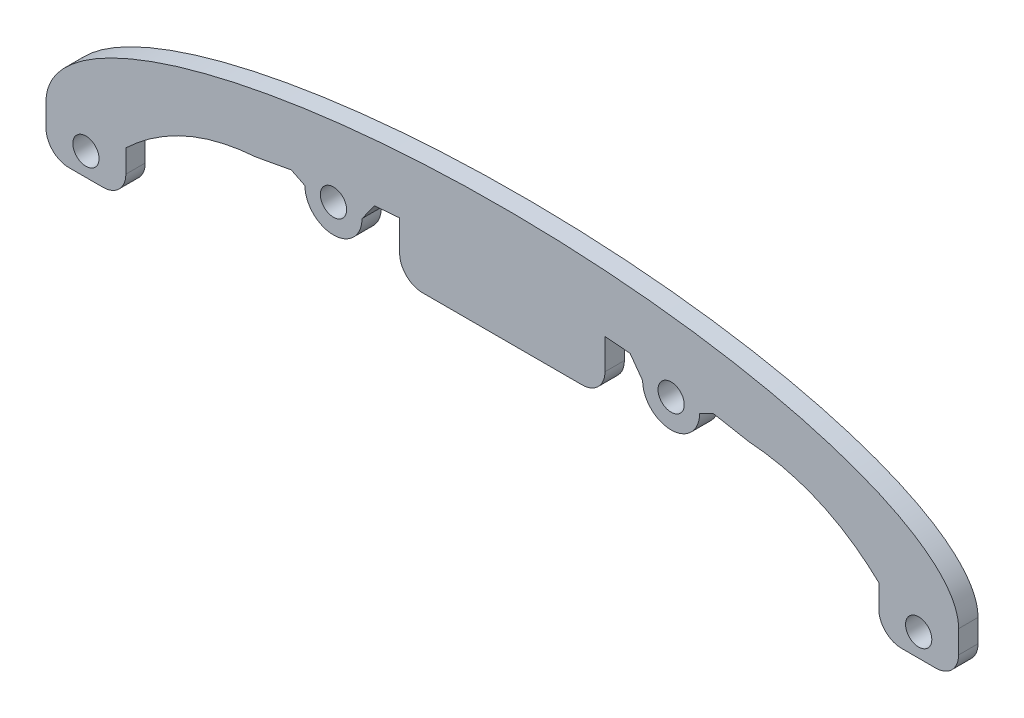
ISO-10303-21;
HEADER;
FILE_DESCRIPTION(('STEP AP214'),'2;1');
FILE_NAME('part.step','',(''),(''),'','','');
FILE_SCHEMA(('AUTOMOTIVE_DESIGN { 1 0 10303 214 1 1 1 1 }'));
ENDSEC;
DATA;
#1=APPLICATION_CONTEXT('core data for automotive mechanical design processes');
#2=APPLICATION_PROTOCOL_DEFINITION('international standard','automotive_design',2000,#1);
#3=PRODUCT_CONTEXT('',#1,'mechanical');
#4=PRODUCT('Part','Part','',(#3));
#5=PRODUCT_RELATED_PRODUCT_CATEGORY('part','',(#4));
#6=PRODUCT_DEFINITION_FORMATION('','',#4);
#7=PRODUCT_DEFINITION_CONTEXT('part definition',#1,'design');
#8=PRODUCT_DEFINITION('design','',#6,#7);
#9=PRODUCT_DEFINITION_SHAPE('','',#8);
#10=(LENGTH_UNIT() NAMED_UNIT(*) SI_UNIT(.MILLI.,.METRE.));
#11=(NAMED_UNIT(*) PLANE_ANGLE_UNIT() SI_UNIT($,.RADIAN.));
#12=(NAMED_UNIT(*) SI_UNIT($,.STERADIAN.) SOLID_ANGLE_UNIT());
#13=UNCERTAINTY_MEASURE_WITH_UNIT(LENGTH_MEASURE(1.E-05),#10,'distance_accuracy_value','');
#14=(GEOMETRIC_REPRESENTATION_CONTEXT(3) GLOBAL_UNCERTAINTY_ASSIGNED_CONTEXT((#13)) GLOBAL_UNIT_ASSIGNED_CONTEXT((#10,
#11,#12)) REPRESENTATION_CONTEXT('',''));
#15=CARTESIAN_POINT('',(0.,0.,0.));
#16=DIRECTION('',(0.,0.,1.));
#17=DIRECTION('',(1.,0.,0.));
#18=AXIS2_PLACEMENT_3D('',#15,#16,#17);
#19=CARTESIAN_POINT('',(21.6102487825062,5.,1.7));
#20=CARTESIAN_POINT('',(21.2180148029138,5.08066905141841,1.7));
#21=CARTESIAN_POINT('',(20.4394979640194,5.23436943529084,1.7));
#22=CARTESIAN_POINT('',(19.4951060891467,5.40604740015627,1.7));
#23=CARTESIAN_POINT('',(18.7420292806283,5.53528947717368,1.7));
#24=CARTESIAN_POINT('',(17.9119906435806,5.6726157972469,1.7));
#25=CARTESIAN_POINT('',(15.626961667524,6.02302536802883,1.7));
#26=CARTESIAN_POINT('',(13.0947737889869,6.32736361113546,1.7));
#27=CARTESIAN_POINT('',(10.8371870665164,6.53364725428514,1.7));
#28=CARTESIAN_POINT('',(10.1053906870872,6.59520308612822,1.7));
#29=CARTESIAN_POINT('',(9.37027735653486,6.65351582896607,1.7));
#30=CARTESIAN_POINT('',(7.93114516513906,6.75743059602858,1.7));
#31=CARTESIAN_POINT('',(4.76847668070915,6.93581519689079,1.7));
#32=CARTESIAN_POINT('',(0.,7.04357036071809,1.7));
#33=CARTESIAN_POINT('',(-4.76847668070919,6.93581519689078,1.7));
#34=CARTESIAN_POINT('',(-7.93114516513908,6.75743059602857,1.7));
#35=CARTESIAN_POINT('',(-9.37027735653483,6.65351582896607,1.7));
#36=CARTESIAN_POINT('',(-10.105390687087,6.59520308612823,1.7));
#37=CARTESIAN_POINT('',(-10.8371870665162,6.53364725428516,1.7));
#38=CARTESIAN_POINT('',(-13.0947737889867,6.32736361113549,1.7));
#39=CARTESIAN_POINT('',(-15.6269616675239,6.02302536802885,1.7));
#40=CARTESIAN_POINT('',(-17.9119906435806,5.6726157972469,1.7));
#41=CARTESIAN_POINT('',(-18.7420292806283,5.53528947717368,1.7));
#42=CARTESIAN_POINT('',(-19.4951060891467,5.40604740015626,1.7));
#43=CARTESIAN_POINT('',(-20.4394979640194,5.23436943529084,1.7));
#44=CARTESIAN_POINT('',(-21.2180148029138,5.0806690514184,1.7));
#45=CARTESIAN_POINT('',(-21.6102487825062,5.,1.7));
#46=B_SPLINE_CURVE_WITH_KNOTS('',3,(#19,#20,#21,#22,#23,#24,#25,#26,#27,#28,#29,#30,#31,#32,#33,
#34,#35,#36,#37,#38,#39,#40,#41,#42,#43,#44,#45),.UNSPECIFIED.,.F.,.F.,(4,1,1,1,1,1,1,1,1,1,1,1,
1,1,1,1,1,1,1,1,1,1,1,1,4),(-2.17175977459974,-2.13419955911194,-2.09663934362414,
-2.08415274139204,-2.06537263364814,-2.02151891264853,-1.88132786482525,-1.85159212307353,
-1.83672425219766,-1.8218563813218,-1.79212063957008,-1.72103718874611,-1.5707963267949,
-1.42055546484369,-1.34947201401971,-1.31973627226799,-1.30486840139213,-1.29000053051627,
-1.26026478876455,-1.12007374094126,-1.07622001994166,-1.05743991219776,-1.04495330996566,
-1.00739309447786,-0.969832878990053),.UNSPECIFIED.);
#47=DIRECTION('',(0.,0.,-1.));
#48=VECTOR('',#47,1.);
#49=SURFACE_OF_LINEAR_EXTRUSION('',#46,#48);
#50=CARTESIAN_POINT('',(21.6102487825062,5.,0.));
#51=CARTESIAN_POINT('',(21.2180148029138,5.08066905141841,0.));
#52=CARTESIAN_POINT('',(20.4394979640194,5.23436943529084,0.));
#53=CARTESIAN_POINT('',(19.4951060891467,5.40604740015627,0.));
#54=CARTESIAN_POINT('',(18.7420292806283,5.53528947717368,0.));
#55=CARTESIAN_POINT('',(17.9119906435806,5.6726157972469,0.));
#56=CARTESIAN_POINT('',(15.626961667524,6.02302536802883,0.));
#57=CARTESIAN_POINT('',(13.0947737889869,6.32736361113546,0.));
#58=CARTESIAN_POINT('',(10.8371870665164,6.53364725428514,0.));
#59=CARTESIAN_POINT('',(10.1053906870872,6.59520308612822,0.));
#60=CARTESIAN_POINT('',(9.37027735653486,6.65351582896607,0.));
#61=CARTESIAN_POINT('',(7.93114516513906,6.75743059602858,0.));
#62=CARTESIAN_POINT('',(4.76847668070915,6.93581519689079,0.));
#63=CARTESIAN_POINT('',(0.,7.04357036071809,0.));
#64=CARTESIAN_POINT('',(-4.76847668070919,6.93581519689078,0.));
#65=CARTESIAN_POINT('',(-7.93114516513908,6.75743059602857,0.));
#66=CARTESIAN_POINT('',(-9.37027735653483,6.65351582896607,0.));
#67=CARTESIAN_POINT('',(-10.105390687087,6.59520308612823,0.));
#68=CARTESIAN_POINT('',(-10.8371870665162,6.53364725428516,0.));
#69=CARTESIAN_POINT('',(-13.0947737889867,6.32736361113549,0.));
#70=CARTESIAN_POINT('',(-15.6269616675239,6.02302536802885,0.));
#71=CARTESIAN_POINT('',(-17.9119906435806,5.6726157972469,0.));
#72=CARTESIAN_POINT('',(-18.7420292806283,5.53528947717368,0.));
#73=CARTESIAN_POINT('',(-19.4951060891467,5.40604740015626,0.));
#74=CARTESIAN_POINT('',(-20.4394979640194,5.23436943529084,0.));
#75=CARTESIAN_POINT('',(-21.2180148029138,5.0806690514184,0.));
#76=CARTESIAN_POINT('',(-21.6102487825062,5.,0.));
#77=B_SPLINE_CURVE_WITH_KNOTS('',3,(#50,#51,#52,#53,#54,#55,#56,#57,#58,#59,#60,#61,#62,#63,#64,
#65,#66,#67,#68,#69,#70,#71,#72,#73,#74,#75,#76),.UNSPECIFIED.,.F.,.F.,(4,1,1,1,1,1,1,1,1,1,1,1,
1,1,1,1,1,1,1,1,1,1,1,1,4),(-2.17175977459974,-2.13419955911194,-2.09663934362414,
-2.08415274139204,-2.06537263364814,-2.02151891264853,-1.88132786482525,-1.85159212307353,
-1.83672425219766,-1.8218563813218,-1.79212063957008,-1.72103718874611,-1.5707963267949,
-1.42055546484369,-1.34947201401971,-1.31973627226799,-1.30486840139213,-1.29000053051627,
-1.26026478876455,-1.12007374094126,-1.07622001994166,-1.05743991219776,-1.04495330996566,
-1.00739309447786,-0.969832878990053),.UNSPECIFIED.);
#78=CARTESIAN_POINT('',(21.6102487825062,5.,0.));
#79=VERTEX_POINT('',#78);
#80=CARTESIAN_POINT('',(18.5,5.57514102727303,0.));
#81=VERTEX_POINT('',#80);
#82=EDGE_CURVE('E234',#79,#81,#77,.T.);
#83=ORIENTED_EDGE('',*,*,#82,.F.);
#84=DIRECTION('',(0.,0.,-1.));
#85=VECTOR('',#84,1.);
#86=CARTESIAN_POINT('',(21.6102487825062,5.,1.7));
#87=LINE('',#86,#85);
#88=CARTESIAN_POINT('',(21.6102487825062,5.,1.7));
#89=VERTEX_POINT('',#88);
#90=EDGE_CURVE('E229',#89,#79,#87,.T.);
#91=ORIENTED_EDGE('',*,*,#90,.F.);
#92=CARTESIAN_POINT('',(18.5,5.57514102727303,1.7));
#93=VERTEX_POINT('',#92);
#94=EDGE_CURVE('E232',#89,#93,#46,.T.);
#95=ORIENTED_EDGE('',*,*,#94,.T.);
#96=DIRECTION('',(0.,0.,-1.));
#97=VECTOR('',#96,1.);
#98=CARTESIAN_POINT('',(18.5,5.57514102727303,1.7));
#99=LINE('',#98,#97);
#100=EDGE_CURVE('E316',#93,#81,#99,.T.);
#101=ORIENTED_EDGE('',*,*,#100,.T.);
#102=EDGE_LOOP('',(#83,#91,#95,#101));
#103=FACE_BOUND('',#102,.T.);
#104=ADVANCED_FACE('F41',(#103),#49,.T.);
#105=CARTESIAN_POINT('',(21.6102487825062,5.,1.7));
#106=CARTESIAN_POINT('',(28.2034208752882,4.53862996030731,1.7));
#107=CARTESIAN_POINT('',(33.,0.,1.7));
#108=B_SPLINE_CURVE_WITH_KNOTS('',2,(#105,#106,#107),.UNSPECIFIED.,.F.,.F.,(3,3),(0.,1.),.UNSPECIFIED.);
#109=DIRECTION('',(0.,0.,-1.));
#110=VECTOR('',#109,1.);
#111=SURFACE_OF_LINEAR_EXTRUSION('',#108,#110);
#112=CARTESIAN_POINT('',(21.6102487825062,5.,0.));
#113=CARTESIAN_POINT('',(28.2034208752882,4.53862996030731,0.));
#114=CARTESIAN_POINT('',(33.,0.,0.));
#115=B_SPLINE_CURVE_WITH_KNOTS('',2,(#112,#113,#114),.UNSPECIFIED.,.F.,.F.,(3,3),(0.,1.),.UNSPECIFIED.);
#116=CARTESIAN_POINT('',(33.,0.,0.));
#117=VERTEX_POINT('',#116);
#118=EDGE_CURVE('E321',#79,#117,#115,.T.);
#119=ORIENTED_EDGE('',*,*,#118,.T.);
#120=DIRECTION('',(0.,0.,-1.));
#121=VECTOR('',#120,1.);
#122=CARTESIAN_POINT('',(33.,0.,1.7));
#123=LINE('',#122,#121);
#124=CARTESIAN_POINT('',(33.,0.,1.7));
#125=VERTEX_POINT('',#124);
#126=EDGE_CURVE('E239',#125,#117,#123,.T.);
#127=ORIENTED_EDGE('',*,*,#126,.F.);
#128=EDGE_CURVE('E242',#89,#125,#108,.T.);
#129=ORIENTED_EDGE('',*,*,#128,.F.);
#130=ORIENTED_EDGE('',*,*,#90,.T.);
#131=EDGE_LOOP('',(#119,#127,#129,#130));
#132=FACE_BOUND('',#131,.T.);
#133=ADVANCED_FACE('F243',(#132),#111,.F.);
#134=CARTESIAN_POINT('',(33.,0.,1.7));
#135=DIRECTION('',(1.,0.,0.));
#136=DIRECTION('',(0.,0.,-1.));
#137=AXIS2_PLACEMENT_3D('',#134,#135,#136);
#138=PLANE('',#137);
#139=DIRECTION('',(0.,-1.,0.));
#140=VECTOR('',#139,1.);
#141=CARTESIAN_POINT('',(33.,0.,0.));
#142=LINE('',#141,#140);
#143=CARTESIAN_POINT('',(33.,-2.00000000000001,0.));
#144=VERTEX_POINT('',#143);
#145=EDGE_CURVE('E332',#117,#144,#142,.T.);
#146=ORIENTED_EDGE('',*,*,#145,.T.);
#147=DIRECTION('',(0.,0.,-1.));
#148=VECTOR('',#147,1.);
#149=CARTESIAN_POINT('',(33.,-2.00000000000001,1.7));
#150=LINE('',#149,#148);
#151=CARTESIAN_POINT('',(33.,-2.00000000000001,1.7));
#152=VERTEX_POINT('',#151);
#153=EDGE_CURVE('E11',#144,#152,#150,.F.);
#154=ORIENTED_EDGE('',*,*,#153,.T.);
#155=DIRECTION('',(0.,-1.,0.));
#156=VECTOR('',#155,1.);
#157=CARTESIAN_POINT('',(33.,0.,1.7));
#158=LINE('',#157,#156);
#159=EDGE_CURVE('E248',#125,#152,#158,.T.);
#160=ORIENTED_EDGE('',*,*,#159,.F.);
#161=ORIENTED_EDGE('',*,*,#126,.T.);
#162=EDGE_LOOP('',(#146,#154,#160,#161));
#163=FACE_BOUND('',#162,.T.);
#164=ADVANCED_FACE('F595',(#163),#138,.F.);
#165=CARTESIAN_POINT('',(0.,-4.00000000000001,1.7));
#166=DIRECTION('',(0.,1.,0.));
#167=DIRECTION('',(0.,0.,1.));
#168=AXIS2_PLACEMENT_3D('',#165,#166,#167);
#169=PLANE('',#168);
#170=DIRECTION('',(1.,0.,0.));
#171=VECTOR('',#170,1.);
#172=CARTESIAN_POINT('',(0.,-4.00000000000001,0.));
#173=LINE('',#172,#171);
#174=CARTESIAN_POINT('',(35.,-4.00000000000001,0.));
#175=VERTEX_POINT('',#174);
#176=CARTESIAN_POINT('',(38.,-4.00000000000001,0.));
#177=VERTEX_POINT('',#176);
#178=EDGE_CURVE('E339',#175,#177,#173,.T.);
#179=ORIENTED_EDGE('',*,*,#178,.T.);
#180=DIRECTION('',(0.,0.,-1.));
#181=VECTOR('',#180,1.);
#182=CARTESIAN_POINT('',(38.,-4.00000000000001,1.7));
#183=LINE('',#182,#181);
#184=CARTESIAN_POINT('',(38.,-4.00000000000001,1.7));
#185=VERTEX_POINT('',#184);
#186=EDGE_CURVE('E50',#177,#185,#183,.F.);
#187=ORIENTED_EDGE('',*,*,#186,.T.);
#188=DIRECTION('',(1.,0.,0.));
#189=VECTOR('',#188,1.);
#190=CARTESIAN_POINT('',(0.,-4.00000000000001,1.7));
#191=LINE('',#190,#189);
#192=CARTESIAN_POINT('',(35.,-4.00000000000001,1.7));
#193=VERTEX_POINT('',#192);
#194=EDGE_CURVE('E520',#193,#185,#191,.T.);
#195=ORIENTED_EDGE('',*,*,#194,.F.);
#196=DIRECTION('',(0.,0.,-1.));
#197=VECTOR('',#196,1.);
#198=CARTESIAN_POINT('',(35.,-4.00000000000001,1.7));
#199=LINE('',#198,#197);
#200=EDGE_CURVE('E511',#193,#175,#199,.T.);
#201=ORIENTED_EDGE('',*,*,#200,.T.);
#202=EDGE_LOOP('',(#179,#187,#195,#201));
#203=FACE_BOUND('',#202,.T.);
#204=ADVANCED_FACE('F519',(#203),#169,.F.);
#205=CARTESIAN_POINT('',(40.,0.,1.7));
#206=DIRECTION('',(-1.,0.,0.));
#207=DIRECTION('',(0.,0.,1.));
#208=AXIS2_PLACEMENT_3D('',#205,#206,#207);
#209=PLANE('',#208);
#210=DIRECTION('',(0.,1.,0.));
#211=VECTOR('',#210,1.);
#212=CARTESIAN_POINT('',(40.,0.,1.7));
#213=LINE('',#212,#211);
#214=CARTESIAN_POINT('',(40.,-2.00000000000001,1.7));
#215=VERTEX_POINT('',#214);
#216=CARTESIAN_POINT('',(40.,0.,1.7));
#217=VERTEX_POINT('',#216);
#218=EDGE_CURVE('E528',#215,#217,#213,.T.);
#219=ORIENTED_EDGE('',*,*,#218,.F.);
#220=DIRECTION('',(0.,0.,-1.));
#221=VECTOR('',#220,1.);
#222=CARTESIAN_POINT('',(40.,-2.00000000000001,1.7));
#223=LINE('',#222,#221);
#224=CARTESIAN_POINT('',(40.,-2.00000000000001,0.));
#225=VERTEX_POINT('',#224);
#226=EDGE_CURVE('E507',#215,#225,#223,.T.);
#227=ORIENTED_EDGE('',*,*,#226,.T.);
#228=DIRECTION('',(0.,1.,0.));
#229=VECTOR('',#228,1.);
#230=CARTESIAN_POINT('',(40.,0.,0.));
#231=LINE('',#230,#229);
#232=CARTESIAN_POINT('',(40.,0.,0.));
#233=VERTEX_POINT('',#232);
#234=EDGE_CURVE('E343',#225,#233,#231,.T.);
#235=ORIENTED_EDGE('',*,*,#234,.T.);
#236=DIRECTION('',(0.,0.,-1.));
#237=VECTOR('',#236,1.);
#238=CARTESIAN_POINT('',(40.,0.,1.7));
#239=LINE('',#238,#237);
#240=EDGE_CURVE('E440',#217,#233,#239,.T.);
#241=ORIENTED_EDGE('',*,*,#240,.F.);
#242=EDGE_LOOP('',(#219,#227,#235,#241));
#243=FACE_BOUND('',#242,.T.);
#244=ADVANCED_FACE('F534',(#243),#209,.F.);
#245=CARTESIAN_POINT('',(0.,0.,1.7));
#246=DIRECTION('',(0.,0.,1.));
#247=DIRECTION('',(-1.,0.,0.));
#248=AXIS2_PLACEMENT_3D('',#245,#246,#247);
#249=ELLIPSE('',#248,40.,12.);
#250=DIRECTION('',(0.,0.,-1.));
#251=VECTOR('',#250,1.);
#252=SURFACE_OF_LINEAR_EXTRUSION('',#249,#251);
#253=CARTESIAN_POINT('',(0.,0.,0.));
#254=DIRECTION('',(0.,0.,1.));
#255=DIRECTION('',(-1.,0.,0.));
#256=AXIS2_PLACEMENT_3D('',#253,#254,#255);
#257=ELLIPSE('',#256,40.,12.);
#258=CARTESIAN_POINT('',(-40.,0.,0.));
#259=VERTEX_POINT('',#258);
#260=EDGE_CURVE('E346',#233,#259,#257,.T.);
#261=ORIENTED_EDGE('',*,*,#260,.T.);
#262=DIRECTION('',(0.,0.,-1.));
#263=VECTOR('',#262,1.);
#264=CARTESIAN_POINT('',(-40.,0.,1.7));
#265=LINE('',#264,#263);
#266=CARTESIAN_POINT('',(-40.,0.,1.7));
#267=VERTEX_POINT('',#266);
#268=EDGE_CURVE('E436',#267,#259,#265,.T.);
#269=ORIENTED_EDGE('',*,*,#268,.F.);
#270=EDGE_CURVE('E553',#217,#267,#249,.T.);
#271=ORIENTED_EDGE('',*,*,#270,.F.);
#272=ORIENTED_EDGE('',*,*,#240,.T.);
#273=EDGE_LOOP('',(#261,#269,#271,#272));
#274=FACE_BOUND('',#273,.T.);
#275=ADVANCED_FACE('F543',(#274),#252,.F.);
#276=CARTESIAN_POINT('',(-40.,0.,1.7));
#277=DIRECTION('',(1.,0.,0.));
#278=DIRECTION('',(0.,0.,-1.));
#279=AXIS2_PLACEMENT_3D('',#276,#277,#278);
#280=PLANE('',#279);
#281=DIRECTION('',(0.,-1.,0.));
#282=VECTOR('',#281,1.);
#283=CARTESIAN_POINT('',(-40.,0.,0.));
#284=LINE('',#283,#282);
#285=CARTESIAN_POINT('',(-40.,-2.00000000000001,0.));
#286=VERTEX_POINT('',#285);
#287=EDGE_CURVE('E349',#259,#286,#284,.T.);
#288=ORIENTED_EDGE('',*,*,#287,.T.);
#289=DIRECTION('',(0.,0.,-1.));
#290=VECTOR('',#289,1.);
#291=CARTESIAN_POINT('',(-40.,-2.00000000000001,1.7));
#292=LINE('',#291,#290);
#293=CARTESIAN_POINT('',(-40.,-2.00000000000001,1.7));
#294=VERTEX_POINT('',#293);
#295=EDGE_CURVE('E470',#286,#294,#292,.F.);
#296=ORIENTED_EDGE('',*,*,#295,.T.);
#297=DIRECTION('',(0.,-1.,0.));
#298=VECTOR('',#297,1.);
#299=CARTESIAN_POINT('',(-40.,0.,1.7));
#300=LINE('',#299,#298);
#301=EDGE_CURVE('E549',#267,#294,#300,.T.);
#302=ORIENTED_EDGE('',*,*,#301,.F.);
#303=ORIENTED_EDGE('',*,*,#268,.T.);
#304=EDGE_LOOP('',(#288,#296,#302,#303));
#305=FACE_BOUND('',#304,.T.);
#306=ADVANCED_FACE('F547',(#305),#280,.F.);
#307=CARTESIAN_POINT('',(0.,-4.00000000000001,1.7));
#308=DIRECTION('',(0.,1.,0.));
#309=DIRECTION('',(0.,0.,1.));
#310=AXIS2_PLACEMENT_3D('',#307,#308,#309);
#311=PLANE('',#310);
#312=DIRECTION('',(1.,0.,0.));
#313=VECTOR('',#312,1.);
#314=CARTESIAN_POINT('',(0.,-4.00000000000001,1.7));
#315=LINE('',#314,#313);
#316=CARTESIAN_POINT('',(-38.,-4.00000000000001,1.7));
#317=VERTEX_POINT('',#316);
#318=CARTESIAN_POINT('',(-35.,-4.00000000000001,1.7));
#319=VERTEX_POINT('',#318);
#320=EDGE_CURVE('E552',#317,#319,#315,.T.);
#321=ORIENTED_EDGE('',*,*,#320,.F.);
#322=DIRECTION('',(0.,0.,-1.));
#323=VECTOR('',#322,1.);
#324=CARTESIAN_POINT('',(-38.,-4.00000000000001,1.7));
#325=LINE('',#324,#323);
#326=CARTESIAN_POINT('',(-38.,-4.00000000000001,0.));
#327=VERTEX_POINT('',#326);
#328=EDGE_CURVE('E448',#317,#327,#325,.T.);
#329=ORIENTED_EDGE('',*,*,#328,.T.);
#330=DIRECTION('',(1.,0.,0.));
#331=VECTOR('',#330,1.);
#332=CARTESIAN_POINT('',(0.,-4.00000000000001,0.));
#333=LINE('',#332,#331);
#334=CARTESIAN_POINT('',(-35.,-4.00000000000001,0.));
#335=VERTEX_POINT('',#334);
#336=EDGE_CURVE('E353',#327,#335,#333,.T.);
#337=ORIENTED_EDGE('',*,*,#336,.T.);
#338=DIRECTION('',(0.,0.,-1.));
#339=VECTOR('',#338,1.);
#340=CARTESIAN_POINT('',(-35.,-4.00000000000001,1.7));
#341=LINE('',#340,#339);
#342=EDGE_CURVE('E238',#335,#319,#341,.F.);
#343=ORIENTED_EDGE('',*,*,#342,.T.);
#344=EDGE_LOOP('',(#321,#329,#337,#343));
#345=FACE_BOUND('',#344,.T.);
#346=ADVANCED_FACE('F582',(#345),#311,.F.);
#347=CARTESIAN_POINT('',(-33.,0.,1.7));
#348=DIRECTION('',(-1.,0.,0.));
#349=DIRECTION('',(0.,0.,1.));
#350=AXIS2_PLACEMENT_3D('',#347,#348,#349);
#351=PLANE('',#350);
#352=DIRECTION('',(0.,1.,0.));
#353=VECTOR('',#352,1.);
#354=CARTESIAN_POINT('',(-33.,0.,1.7));
#355=LINE('',#354,#353);
#356=CARTESIAN_POINT('',(-33.,-2.00000000000001,1.7));
#357=VERTEX_POINT('',#356);
#358=CARTESIAN_POINT('',(-33.,0.,1.7));
#359=VERTEX_POINT('',#358);
#360=EDGE_CURVE('E285',#357,#359,#355,.T.);
#361=ORIENTED_EDGE('',*,*,#360,.F.);
#362=DIRECTION('',(0.,0.,-1.));
#363=VECTOR('',#362,1.);
#364=CARTESIAN_POINT('',(-33.,-2.00000000000001,1.7));
#365=LINE('',#364,#363);
#366=CARTESIAN_POINT('',(-33.,-2.00000000000001,0.));
#367=VERTEX_POINT('',#366);
#368=EDGE_CURVE('E490',#357,#367,#365,.T.);
#369=ORIENTED_EDGE('',*,*,#368,.T.);
#370=DIRECTION('',(0.,1.,0.));
#371=VECTOR('',#370,1.);
#372=CARTESIAN_POINT('',(-33.,0.,0.));
#373=LINE('',#372,#371);
#374=CARTESIAN_POINT('',(-33.,0.,0.));
#375=VERTEX_POINT('',#374);
#376=EDGE_CURVE('E357',#367,#375,#373,.T.);
#377=ORIENTED_EDGE('',*,*,#376,.T.);
#378=DIRECTION('',(0.,0.,-1.));
#379=VECTOR('',#378,1.);
#380=CARTESIAN_POINT('',(-33.,0.,1.7));
#381=LINE('',#380,#379);
#382=EDGE_CURVE('E432',#359,#375,#381,.T.);
#383=ORIENTED_EDGE('',*,*,#382,.F.);
#384=EDGE_LOOP('',(#361,#369,#377,#383));
#385=FACE_BOUND('',#384,.T.);
#386=ADVANCED_FACE('F576',(#385),#351,.F.);
#387=CARTESIAN_POINT('',(-21.6102487825062,5.,1.7));
#388=CARTESIAN_POINT('',(-28.2034208752882,4.53862996030728,1.7));
#389=CARTESIAN_POINT('',(-33.,0.,1.7));
#390=B_SPLINE_CURVE_WITH_KNOTS('',2,(#387,#388,#389),.UNSPECIFIED.,.F.,.F.,(3,3),(0.,1.),.UNSPECIFIED.);
#391=DIRECTION('',(0.,0.,-1.));
#392=VECTOR('',#391,1.);
#393=SURFACE_OF_LINEAR_EXTRUSION('',#390,#392);
#394=CARTESIAN_POINT('',(-21.6102487825062,5.,0.));
#395=CARTESIAN_POINT('',(-28.2034208752882,4.53862996030728,0.));
#396=CARTESIAN_POINT('',(-33.,0.,0.));
#397=B_SPLINE_CURVE_WITH_KNOTS('',2,(#394,#395,#396),.UNSPECIFIED.,.F.,.F.,(3,3),(0.,1.),.UNSPECIFIED.);
#398=CARTESIAN_POINT('',(-21.6102487825062,5.,0.));
#399=VERTEX_POINT('',#398);
#400=EDGE_CURVE('E360',#399,#375,#397,.T.);
#401=ORIENTED_EDGE('',*,*,#400,.F.);
#402=DIRECTION('',(0.,0.,-1.));
#403=VECTOR('',#402,1.);
#404=CARTESIAN_POINT('',(-21.6102487825062,5.,1.7));
#405=LINE('',#404,#403);
#406=CARTESIAN_POINT('',(-21.6102487825062,5.,1.7));
#407=VERTEX_POINT('',#406);
#408=EDGE_CURVE('E429',#407,#399,#405,.T.);
#409=ORIENTED_EDGE('',*,*,#408,.F.);
#410=EDGE_CURVE('E276',#407,#359,#390,.T.);
#411=ORIENTED_EDGE('',*,*,#410,.T.);
#412=ORIENTED_EDGE('',*,*,#382,.T.);
#413=EDGE_LOOP('',(#401,#409,#411,#412));
#414=FACE_BOUND('',#413,.T.);
#415=ADVANCED_FACE('F571',(#414),#393,.T.);
#416=CARTESIAN_POINT('',(-18.5,5.57514102727304,0.));
#417=VERTEX_POINT('',#416);
#418=EDGE_CURVE('E324',#417,#399,#77,.T.);
#419=ORIENTED_EDGE('',*,*,#418,.F.);
#420=DIRECTION('',(0.,0.,-1.));
#421=VECTOR('',#420,1.);
#422=CARTESIAN_POINT('',(-18.5,5.57514102727304,1.7));
#423=LINE('',#422,#421);
#424=CARTESIAN_POINT('',(-18.5,5.57514102727304,1.7));
#425=VERTEX_POINT('',#424);
#426=EDGE_CURVE('E426',#425,#417,#423,.T.);
#427=ORIENTED_EDGE('',*,*,#426,.F.);
#428=EDGE_CURVE('E259',#425,#407,#46,.T.);
#429=ORIENTED_EDGE('',*,*,#428,.T.);
#430=ORIENTED_EDGE('',*,*,#408,.T.);
#431=EDGE_LOOP('',(#419,#427,#429,#430));
#432=FACE_BOUND('',#431,.T.);
#433=ADVANCED_FACE('F575',(#432),#49,.T.);
#434=CARTESIAN_POINT('',(-1.43433888847908,-2.89120494929168,1.7));
#435=DIRECTION('',(-0.44441946457456,-0.895818809529729,0.));
#436=DIRECTION('',(0.895818809529729,-0.44441946457456,0.));
#437=AXIS2_PLACEMENT_3D('',#434,#435,#436);
#438=PLANE('',#437);
#439=DIRECTION('',(-0.895818809529729,0.44441946457456,0.));
#440=VECTOR('',#439,1.);
#441=CARTESIAN_POINT('',(-1.43433888847908,-2.89120494929168,0.));
#442=LINE('',#441,#440);
#443=CARTESIAN_POINT('',(-17.3,4.9798159996936,0.));
#444=VERTEX_POINT('',#443);
#445=EDGE_CURVE('E366',#444,#417,#442,.T.);
#446=ORIENTED_EDGE('',*,*,#445,.F.);
#447=DIRECTION('',(0.,0.,-1.));
#448=VECTOR('',#447,1.);
#449=CARTESIAN_POINT('',(-17.3,4.9798159996936,1.7));
#450=LINE('',#449,#448);
#451=CARTESIAN_POINT('',(-17.3,4.9798159996936,1.7));
#452=VERTEX_POINT('',#451);
#453=EDGE_CURVE('E423',#452,#444,#450,.T.);
#454=ORIENTED_EDGE('',*,*,#453,.F.);
#455=DIRECTION('',(-0.895818809529729,0.44441946457456,0.));
#456=VECTOR('',#455,1.);
#457=CARTESIAN_POINT('',(-1.43433888847908,-2.89120494929168,1.7));
#458=LINE('',#457,#456);
#459=EDGE_CURVE('E275',#452,#425,#458,.T.);
#460=ORIENTED_EDGE('',*,*,#459,.T.);
#461=ORIENTED_EDGE('',*,*,#426,.T.);
#462=EDGE_LOOP('',(#446,#454,#460,#461));
#463=FACE_BOUND('',#462,.T.);
#464=ADVANCED_FACE('F578',(#463),#438,.T.);
#465=CARTESIAN_POINT('',(-14.8,4.9798159996936,1.7));
#466=DIRECTION('',(0.,0.,-1.));
#467=DIRECTION('',(-1.,0.,0.));
#468=AXIS2_PLACEMENT_3D('',#465,#466,#467);
#469=CYLINDRICAL_SURFACE('',#468,2.5);
#470=CARTESIAN_POINT('',(-14.8,4.9798159996936,0.));
#471=DIRECTION('',(0.,0.,1.));
#472=DIRECTION('',(1.,0.,0.));
#473=AXIS2_PLACEMENT_3D('',#470,#471,#472);
#474=CIRCLE('',#473,2.5);
#475=CARTESIAN_POINT('',(-12.3,4.9798159996936,0.));
#476=VERTEX_POINT('',#475);
#477=EDGE_CURVE('E373',#444,#476,#474,.T.);
#478=ORIENTED_EDGE('',*,*,#477,.T.);
#479=DIRECTION('',(0.,0.,-1.));
#480=VECTOR('',#479,1.);
#481=CARTESIAN_POINT('',(-12.3,4.9798159996936,1.7));
#482=LINE('',#481,#480);
#483=CARTESIAN_POINT('',(-12.3,4.9798159996936,1.7));
#484=VERTEX_POINT('',#483);
#485=EDGE_CURVE('E419',#484,#476,#482,.T.);
#486=ORIENTED_EDGE('',*,*,#485,.F.);
#487=CARTESIAN_POINT('',(-14.8,4.9798159996936,1.7));
#488=DIRECTION('',(0.,0.,1.));
#489=DIRECTION('',(1.,0.,0.));
#490=AXIS2_PLACEMENT_3D('',#487,#488,#489);
#491=CIRCLE('',#490,2.5);
#492=EDGE_CURVE('E282',#452,#484,#491,.T.);
#493=ORIENTED_EDGE('',*,*,#492,.F.);
#494=ORIENTED_EDGE('',*,*,#453,.T.);
#495=EDGE_LOOP('',(#478,#486,#493,#494));
#496=FACE_BOUND('',#495,.T.);
#497=ADVANCED_FACE('F691',(#496),#469,.T.);
#498=CARTESIAN_POINT('',(-10.4382474151856,7.55281980570069,1.7));
#499=DIRECTION('',(-0.810160006857971,0.586208805194781,0.));
#500=DIRECTION('',(-0.586208805194781,-0.810160006857971,0.));
#501=AXIS2_PLACEMENT_3D('',#498,#499,#500);
#502=PLANE('',#501);
#503=DIRECTION('',(0.586208805194781,0.810160006857971,0.));
#504=VECTOR('',#503,1.);
#505=CARTESIAN_POINT('',(-10.4382474151856,7.55281980570069,0.));
#506=LINE('',#505,#504);
#507=CARTESIAN_POINT('',(-11.1999999999997,6.50005247455842,0.));
#508=VERTEX_POINT('',#507);
#509=EDGE_CURVE('E376',#476,#508,#506,.T.);
#510=ORIENTED_EDGE('',*,*,#509,.T.);
#511=DIRECTION('',(0.,0.,-1.));
#512=VECTOR('',#511,1.);
#513=CARTESIAN_POINT('',(-11.1999999999997,6.50005247455842,1.7));
#514=LINE('',#513,#512);
#515=CARTESIAN_POINT('',(-11.1999999999997,6.50005247455842,1.7));
#516=VERTEX_POINT('',#515);
#517=EDGE_CURVE('E416',#516,#508,#514,.T.);
#518=ORIENTED_EDGE('',*,*,#517,.F.);
#519=DIRECTION('',(0.586208805194781,0.810160006857971,0.));
#520=VECTOR('',#519,1.);
#521=CARTESIAN_POINT('',(-10.4382474151856,7.55281980570069,1.7));
#522=LINE('',#521,#520);
#523=EDGE_CURVE('E290',#484,#516,#522,.T.);
#524=ORIENTED_EDGE('',*,*,#523,.F.);
#525=ORIENTED_EDGE('',*,*,#485,.T.);
#526=EDGE_LOOP('',(#510,#518,#524,#525));
#527=FACE_BOUND('',#526,.T.);
#528=ADVANCED_FACE('F684',(#527),#502,.F.);
#529=CARTESIAN_POINT('',(-9.,6.6798159996936,0.));
#530=VERTEX_POINT('',#529);
#531=EDGE_CURVE('E380',#530,#508,#77,.T.);
#532=ORIENTED_EDGE('',*,*,#531,.F.);
#533=DIRECTION('',(0.,0.,-1.));
#534=VECTOR('',#533,1.);
#535=CARTESIAN_POINT('',(-9.,6.6798159996936,1.7));
#536=LINE('',#535,#534);
#537=CARTESIAN_POINT('',(-9.,6.6798159996936,1.7));
#538=VERTEX_POINT('',#537);
#539=EDGE_CURVE('E413',#538,#530,#536,.T.);
#540=ORIENTED_EDGE('',*,*,#539,.F.);
#541=EDGE_CURVE('E272',#538,#516,#46,.T.);
#542=ORIENTED_EDGE('',*,*,#541,.T.);
#543=ORIENTED_EDGE('',*,*,#517,.T.);
#544=EDGE_LOOP('',(#532,#540,#542,#543));
#545=FACE_BOUND('',#544,.T.);
#546=ADVANCED_FACE('F673',(#545),#49,.T.);
#547=CARTESIAN_POINT('',(-8.99999999999999,0.,1.7));
#548=DIRECTION('',(1.,0.,0.));
#549=DIRECTION('',(0.,1.,0.));
#550=AXIS2_PLACEMENT_3D('',#547,#548,#549);
#551=PLANE('',#550);
#552=DIRECTION('',(0.,-1.,0.));
#553=VECTOR('',#552,1.);
#554=CARTESIAN_POINT('',(-8.99999999999999,0.,0.));
#555=LINE('',#554,#553);
#556=CARTESIAN_POINT('',(-9.,4.,0.));
#557=VERTEX_POINT('',#556);
#558=EDGE_CURVE('E381',#530,#557,#555,.T.);
#559=ORIENTED_EDGE('',*,*,#558,.T.);
#560=DIRECTION('',(0.,0.,-1.));
#561=VECTOR('',#560,1.);
#562=CARTESIAN_POINT('',(-9.,4.,1.7));
#563=LINE('',#562,#561);
#564=CARTESIAN_POINT('',(-9.,4.,1.7));
#565=VERTEX_POINT('',#564);
#566=EDGE_CURVE('E504',#557,#565,#563,.F.);
#567=ORIENTED_EDGE('',*,*,#566,.T.);
#568=DIRECTION('',(0.,-1.,0.));
#569=VECTOR('',#568,1.);
#570=CARTESIAN_POINT('',(-8.99999999999999,0.,1.7));
#571=LINE('',#570,#569);
#572=EDGE_CURVE('E289',#538,#565,#571,.T.);
#573=ORIENTED_EDGE('',*,*,#572,.F.);
#574=ORIENTED_EDGE('',*,*,#539,.T.);
#575=EDGE_LOOP('',(#559,#567,#573,#574));
#576=FACE_BOUND('',#575,.T.);
#577=ADVANCED_FACE('F683',(#576),#551,.F.);
#578=CARTESIAN_POINT('',(0.,2.,1.7));
#579=DIRECTION('',(0.,1.,0.));
#580=DIRECTION('',(0.,0.,1.));
#581=AXIS2_PLACEMENT_3D('',#578,#579,#580);
#582=PLANE('',#581);
#583=DIRECTION('',(1.,0.,0.));
#584=VECTOR('',#583,1.);
#585=CARTESIAN_POINT('',(0.,2.,0.));
#586=LINE('',#585,#584);
#587=CARTESIAN_POINT('',(-7.,2.,0.));
#588=VERTEX_POINT('',#587);
#589=CARTESIAN_POINT('',(7.,2.,0.));
#590=VERTEX_POINT('',#589);
#591=EDGE_CURVE('E385',#588,#590,#586,.T.);
#592=ORIENTED_EDGE('',*,*,#591,.T.);
#593=DIRECTION('',(0.,0.,-1.));
#594=VECTOR('',#593,1.);
#595=CARTESIAN_POINT('',(7.,2.,1.7));
#596=LINE('',#595,#594);
#597=CARTESIAN_POINT('',(7.,2.,1.7));
#598=VERTEX_POINT('',#597);
#599=EDGE_CURVE('E65',#590,#598,#596,.F.);
#600=ORIENTED_EDGE('',*,*,#599,.T.);
#601=DIRECTION('',(1.,0.,0.));
#602=VECTOR('',#601,1.);
#603=CARTESIAN_POINT('',(0.,2.,1.7));
#604=LINE('',#603,#602);
#605=CARTESIAN_POINT('',(-7.,2.,1.7));
#606=VERTEX_POINT('',#605);
#607=EDGE_CURVE('E296',#606,#598,#604,.T.);
#608=ORIENTED_EDGE('',*,*,#607,.F.);
#609=DIRECTION('',(0.,0.,-1.));
#610=VECTOR('',#609,1.);
#611=CARTESIAN_POINT('',(-7.,2.,1.7));
#612=LINE('',#611,#610);
#613=EDGE_CURVE('E498',#606,#588,#612,.T.);
#614=ORIENTED_EDGE('',*,*,#613,.T.);
#615=EDGE_LOOP('',(#592,#600,#608,#614));
#616=FACE_BOUND('',#615,.T.);
#617=ADVANCED_FACE('F680',(#616),#582,.F.);
#618=CARTESIAN_POINT('',(9.00000000000001,0.,1.7));
#619=DIRECTION('',(1.,0.,0.));
#620=DIRECTION('',(0.,1.,0.));
#621=AXIS2_PLACEMENT_3D('',#618,#619,#620);
#622=PLANE('',#621);
#623=DIRECTION('',(0.,-1.,0.));
#624=VECTOR('',#623,1.);
#625=CARTESIAN_POINT('',(9.00000000000001,0.,1.7));
#626=LINE('',#625,#624);
#627=CARTESIAN_POINT('',(8.99999999999998,6.6798159996936,1.7));
#628=VERTEX_POINT('',#627);
#629=CARTESIAN_POINT('',(9.,4.00000000000001,1.7));
#630=VERTEX_POINT('',#629);
#631=EDGE_CURVE('E271',#628,#630,#626,.T.);
#632=ORIENTED_EDGE('',*,*,#631,.T.);
#633=DIRECTION('',(0.,0.,-1.));
#634=VECTOR('',#633,1.);
#635=CARTESIAN_POINT('',(9.,4.00000000000001,0.));
#636=LINE('',#635,#634);
#637=CARTESIAN_POINT('',(9.,4.00000000000001,0.));
#638=VERTEX_POINT('',#637);
#639=EDGE_CURVE('E494',#630,#638,#636,.T.);
#640=ORIENTED_EDGE('',*,*,#639,.T.);
#641=DIRECTION('',(0.,-1.,0.));
#642=VECTOR('',#641,1.);
#643=CARTESIAN_POINT('',(9.00000000000001,0.,0.));
#644=LINE('',#643,#642);
#645=CARTESIAN_POINT('',(8.99999999999998,6.6798159996936,0.));
#646=VERTEX_POINT('',#645);
#647=EDGE_CURVE('E388',#646,#638,#644,.T.);
#648=ORIENTED_EDGE('',*,*,#647,.F.);
#649=DIRECTION('',(0.,0.,-1.));
#650=VECTOR('',#649,1.);
#651=CARTESIAN_POINT('',(8.99999999999998,6.6798159996936,1.7));
#652=LINE('',#651,#650);
#653=EDGE_CURVE('E410',#628,#646,#652,.T.);
#654=ORIENTED_EDGE('',*,*,#653,.F.);
#655=EDGE_LOOP('',(#632,#640,#648,#654));
#656=FACE_BOUND('',#655,.T.);
#657=ADVANCED_FACE('F675',(#656),#622,.T.);
#658=CARTESIAN_POINT('',(11.2,6.50005247455841,0.));
#659=VERTEX_POINT('',#658);
#660=EDGE_CURVE('E323',#659,#646,#77,.T.);
#661=ORIENTED_EDGE('',*,*,#660,.F.);
#662=DIRECTION('',(0.,0.,-1.));
#663=VECTOR('',#662,1.);
#664=CARTESIAN_POINT('',(11.2,6.50005247455841,1.7));
#665=LINE('',#664,#663);
#666=CARTESIAN_POINT('',(11.2,6.50005247455841,1.7));
#667=VERTEX_POINT('',#666);
#668=EDGE_CURVE('E407',#667,#659,#665,.T.);
#669=ORIENTED_EDGE('',*,*,#668,.F.);
#670=EDGE_CURVE('E258',#667,#628,#46,.T.);
#671=ORIENTED_EDGE('',*,*,#670,.T.);
#672=ORIENTED_EDGE('',*,*,#653,.T.);
#673=EDGE_LOOP('',(#661,#669,#671,#672));
#674=FACE_BOUND('',#673,.T.);
#675=ADVANCED_FACE('F667',(#674),#49,.T.);
#676=CARTESIAN_POINT('',(10.4382474151871,7.55281980569946,1.7));
#677=DIRECTION('',(-0.810160006858055,-0.586208805194665,0.));
#678=DIRECTION('',(0.586208805194665,-0.810160006858055,0.));
#679=AXIS2_PLACEMENT_3D('',#676,#677,#678);
#680=PLANE('',#679);
#681=DIRECTION('',(-0.586208805194665,0.810160006858055,0.));
#682=VECTOR('',#681,1.);
#683=CARTESIAN_POINT('',(10.4382474151871,7.55281980569946,0.));
#684=LINE('',#683,#682);
#685=CARTESIAN_POINT('',(12.3,4.9798159996936,0.));
#686=VERTEX_POINT('',#685);
#687=EDGE_CURVE('E392',#686,#659,#684,.T.);
#688=ORIENTED_EDGE('',*,*,#687,.F.);
#689=DIRECTION('',(0.,0.,-1.));
#690=VECTOR('',#689,1.);
#691=CARTESIAN_POINT('',(12.3,4.9798159996936,1.7));
#692=LINE('',#691,#690);
#693=CARTESIAN_POINT('',(12.3,4.9798159996936,1.7));
#694=VERTEX_POINT('',#693);
#695=EDGE_CURVE('E404',#694,#686,#692,.T.);
#696=ORIENTED_EDGE('',*,*,#695,.F.);
#697=DIRECTION('',(-0.586208805194665,0.810160006858055,0.));
#698=VECTOR('',#697,1.);
#699=CARTESIAN_POINT('',(10.4382474151871,7.55281980569946,1.7));
#700=LINE('',#699,#698);
#701=EDGE_CURVE('E270',#694,#667,#700,.T.);
#702=ORIENTED_EDGE('',*,*,#701,.T.);
#703=ORIENTED_EDGE('',*,*,#668,.T.);
#704=EDGE_LOOP('',(#688,#696,#702,#703));
#705=FACE_BOUND('',#704,.T.);
#706=ADVANCED_FACE('F626',(#705),#680,.T.);
#707=CARTESIAN_POINT('',(14.8,4.9798159996936,1.7));
#708=DIRECTION('',(0.,0.,-1.));
#709=DIRECTION('',(-1.,0.,0.));
#710=AXIS2_PLACEMENT_3D('',#707,#708,#709);
#711=CYLINDRICAL_SURFACE('',#710,2.5);
#712=CARTESIAN_POINT('',(14.8,4.9798159996936,0.));
#713=DIRECTION('',(0.,0.,1.));
#714=DIRECTION('',(1.,0.,0.));
#715=AXIS2_PLACEMENT_3D('',#712,#713,#714);
#716=CIRCLE('',#715,2.5);
#717=CARTESIAN_POINT('',(17.3,4.9798159996936,0.));
#718=VERTEX_POINT('',#717);
#719=EDGE_CURVE('E262',#686,#718,#716,.T.);
#720=ORIENTED_EDGE('',*,*,#719,.T.);
#721=DIRECTION('',(0.,0.,-1.));
#722=VECTOR('',#721,1.);
#723=CARTESIAN_POINT('',(17.3,4.9798159996936,1.7));
#724=LINE('',#723,#722);
#725=CARTESIAN_POINT('',(17.3,4.9798159996936,1.7));
#726=VERTEX_POINT('',#725);
#727=EDGE_CURVE('E400',#726,#718,#724,.T.);
#728=ORIENTED_EDGE('',*,*,#727,.F.);
#729=CARTESIAN_POINT('',(14.8,4.9798159996936,1.7));
#730=DIRECTION('',(0.,0.,1.));
#731=DIRECTION('',(1.,0.,0.));
#732=AXIS2_PLACEMENT_3D('',#729,#730,#731);
#733=CIRCLE('',#732,2.5);
#734=EDGE_CURVE('E311',#694,#726,#733,.T.);
#735=ORIENTED_EDGE('',*,*,#734,.F.);
#736=ORIENTED_EDGE('',*,*,#695,.T.);
#737=EDGE_LOOP('',(#720,#728,#735,#736));
#738=FACE_BOUND('',#737,.T.);
#739=ADVANCED_FACE('F623',(#738),#711,.T.);
#740=CARTESIAN_POINT('',(1.43433888847901,-2.89120494929158,1.7));
#741=DIRECTION('',(-0.444419464574554,0.895818809529732,0.));
#742=DIRECTION('',(-0.895818809529732,-0.444419464574554,0.));
#743=AXIS2_PLACEMENT_3D('',#740,#741,#742);
#744=PLANE('',#743);
#745=DIRECTION('',(0.895818809529732,0.444419464574554,0.));
#746=VECTOR('',#745,1.);
#747=CARTESIAN_POINT('',(1.43433888847901,-2.89120494929158,0.));
#748=LINE('',#747,#746);
#749=EDGE_CURVE('E256',#718,#81,#748,.T.);
#750=ORIENTED_EDGE('',*,*,#749,.T.);
#751=ORIENTED_EDGE('',*,*,#100,.F.);
#752=DIRECTION('',(0.895818809529732,0.444419464574554,0.));
#753=VECTOR('',#752,1.);
#754=CARTESIAN_POINT('',(1.43433888847901,-2.89120494929158,1.7));
#755=LINE('',#754,#753);
#756=EDGE_CURVE('E253',#726,#93,#755,.T.);
#757=ORIENTED_EDGE('',*,*,#756,.F.);
#758=ORIENTED_EDGE('',*,*,#727,.T.);
#759=EDGE_LOOP('',(#750,#751,#757,#758));
#760=FACE_BOUND('',#759,.T.);
#761=ADVANCED_FACE('F619',(#760),#744,.F.);
#762=CARTESIAN_POINT('',(0.,0.,1.7));
#763=DIRECTION('',(0.,0.,1.));
#764=DIRECTION('',(1.,0.,0.));
#765=AXIS2_PLACEMENT_3D('',#762,#763,#764);
#766=PLANE('',#765);
#767=CARTESIAN_POINT('',(36.5,-2.00000000000001,1.7));
#768=DIRECTION('',(0.,0.,1.));
#769=DIRECTION('',(1.,0.,0.));
#770=AXIS2_PLACEMENT_3D('',#767,#768,#769);
#771=CIRCLE('',#770,1.15);
#772=CARTESIAN_POINT('',(37.65,-2.00000000000001,1.7));
#773=VERTEX_POINT('',#772);
#774=EDGE_CURVE('E961',#773,#773,#771,.T.);
#775=ORIENTED_EDGE('',*,*,#774,.F.);
#776=EDGE_LOOP('',(#775));
#777=FACE_BOUND('',#776,.T.);
#778=CARTESIAN_POINT('',(-36.5,-2.00000000000001,1.7));
#779=DIRECTION('',(0.,0.,1.));
#780=DIRECTION('',(1.,0.,0.));
#781=AXIS2_PLACEMENT_3D('',#778,#779,#780);
#782=CIRCLE('',#781,1.15);
#783=CARTESIAN_POINT('',(-35.35,-2.00000000000001,1.7));
#784=VERTEX_POINT('',#783);
#785=EDGE_CURVE('E969',#784,#784,#782,.T.);
#786=ORIENTED_EDGE('',*,*,#785,.F.);
#787=EDGE_LOOP('',(#786));
#788=FACE_BOUND('',#787,.T.);
#789=CARTESIAN_POINT('',(14.8,4.9798159996936,1.7));
#790=DIRECTION('',(0.,0.,1.));
#791=DIRECTION('',(1.,0.,0.));
#792=AXIS2_PLACEMENT_3D('',#789,#790,#791);
#793=CIRCLE('',#792,1.15);
#794=CARTESIAN_POINT('',(15.95,4.9798159996936,1.7));
#795=VERTEX_POINT('',#794);
#796=EDGE_CURVE('E958',#795,#795,#793,.T.);
#797=ORIENTED_EDGE('',*,*,#796,.F.);
#798=EDGE_LOOP('',(#797));
#799=FACE_BOUND('',#798,.T.);
#800=CARTESIAN_POINT('',(-14.8,4.9798159996936,1.7));
#801=DIRECTION('',(0.,0.,1.));
#802=DIRECTION('',(1.,0.,0.));
#803=AXIS2_PLACEMENT_3D('',#800,#801,#802);
#804=CIRCLE('',#803,1.15);
#805=CARTESIAN_POINT('',(-13.65,4.9798159996936,1.7));
#806=VERTEX_POINT('',#805);
#807=EDGE_CURVE('E950',#806,#806,#804,.T.);
#808=ORIENTED_EDGE('',*,*,#807,.F.);
#809=EDGE_LOOP('',(#808));
#810=FACE_BOUND('',#809,.T.);
#811=ORIENTED_EDGE('',*,*,#301,.T.);
#812=CARTESIAN_POINT('',(-38.,-2.00000000000001,1.7));
#813=DIRECTION('',(0.,0.,1.));
#814=DIRECTION('',(1.,0.,0.));
#815=AXIS2_PLACEMENT_3D('',#812,#813,#814);
#816=CIRCLE('',#815,2.);
#817=EDGE_CURVE('E487',#294,#317,#816,.T.);
#818=ORIENTED_EDGE('',*,*,#817,.T.);
#819=ORIENTED_EDGE('',*,*,#320,.T.);
#820=CARTESIAN_POINT('',(-35.,-2.00000000000001,1.7));
#821=DIRECTION('',(0.,0.,1.));
#822=DIRECTION('',(1.,0.,0.));
#823=AXIS2_PLACEMENT_3D('',#820,#821,#822);
#824=CIRCLE('',#823,2.);
#825=EDGE_CURVE('E484',#319,#357,#824,.T.);
#826=ORIENTED_EDGE('',*,*,#825,.T.);
#827=ORIENTED_EDGE('',*,*,#360,.T.);
#828=ORIENTED_EDGE('',*,*,#410,.F.);
#829=ORIENTED_EDGE('',*,*,#428,.F.);
#830=ORIENTED_EDGE('',*,*,#459,.F.);
#831=ORIENTED_EDGE('',*,*,#492,.T.);
#832=ORIENTED_EDGE('',*,*,#523,.T.);
#833=ORIENTED_EDGE('',*,*,#541,.F.);
#834=ORIENTED_EDGE('',*,*,#572,.T.);
#835=CARTESIAN_POINT('',(-7.,4.,1.7));
#836=DIRECTION('',(0.,0.,1.));
#837=DIRECTION('',(1.,0.,0.));
#838=AXIS2_PLACEMENT_3D('',#835,#836,#837);
#839=CIRCLE('',#838,2.);
#840=EDGE_CURVE('E479',#565,#606,#839,.T.);
#841=ORIENTED_EDGE('',*,*,#840,.T.);
#842=ORIENTED_EDGE('',*,*,#607,.T.);
#843=CARTESIAN_POINT('',(7.,4.,1.7));
#844=DIRECTION('',(0.,0.,1.));
#845=DIRECTION('',(1.,0.,0.));
#846=AXIS2_PLACEMENT_3D('',#843,#844,#845);
#847=CIRCLE('',#846,2.);
#848=EDGE_CURVE('E57',#598,#630,#847,.T.);
#849=ORIENTED_EDGE('',*,*,#848,.T.);
#850=ORIENTED_EDGE('',*,*,#631,.F.);
#851=ORIENTED_EDGE('',*,*,#670,.F.);
#852=ORIENTED_EDGE('',*,*,#701,.F.);
#853=ORIENTED_EDGE('',*,*,#734,.T.);
#854=ORIENTED_EDGE('',*,*,#756,.T.);
#855=ORIENTED_EDGE('',*,*,#94,.F.);
#856=ORIENTED_EDGE('',*,*,#128,.T.);
#857=ORIENTED_EDGE('',*,*,#159,.T.);
#858=CARTESIAN_POINT('',(35.,-2.00000000000001,1.7));
#859=DIRECTION('',(0.,0.,1.));
#860=DIRECTION('',(1.,0.,0.));
#861=AXIS2_PLACEMENT_3D('',#858,#859,#860);
#862=CIRCLE('',#861,2.);
#863=EDGE_CURVE('E473',#152,#193,#862,.T.);
#864=ORIENTED_EDGE('',*,*,#863,.T.);
#865=ORIENTED_EDGE('',*,*,#194,.T.);
#866=CARTESIAN_POINT('',(38.,-2.00000000000001,1.7));
#867=DIRECTION('',(0.,0.,1.));
#868=DIRECTION('',(1.,0.,0.));
#869=AXIS2_PLACEMENT_3D('',#866,#867,#868);
#870=CIRCLE('',#869,2.);
#871=EDGE_CURVE('E476',#185,#215,#870,.T.);
#872=ORIENTED_EDGE('',*,*,#871,.T.);
#873=ORIENTED_EDGE('',*,*,#218,.T.);
#874=ORIENTED_EDGE('',*,*,#270,.T.);
#875=EDGE_LOOP('',(#811,#818,#819,#826,#827,#828,#829,#830,#831,#832,#833,#834,#841,#842,#849,
#850,#851,#852,#853,#854,#855,#856,#857,#864,#865,#872,#873,#874));
#876=FACE_BOUND('',#875,.T.);
#877=ADVANCED_FACE('F251',(#777,#788,#799,#810,#876),#766,.T.);
#878=CARTESIAN_POINT('',(0.,0.,0.));
#879=DIRECTION('',(0.,0.,1.));
#880=DIRECTION('',(1.,0.,0.));
#881=AXIS2_PLACEMENT_3D('',#878,#879,#880);
#882=PLANE('',#881);
#883=CARTESIAN_POINT('',(36.5,-2.00000000000001,0.));
#884=DIRECTION('',(0.,0.,1.));
#885=DIRECTION('',(1.,0.,0.));
#886=AXIS2_PLACEMENT_3D('',#883,#884,#885);
#887=CIRCLE('',#886,1.15);
#888=CARTESIAN_POINT('',(37.65,-2.00000000000001,0.));
#889=VERTEX_POINT('',#888);
#890=EDGE_CURVE('E965',#889,#889,#887,.T.);
#891=ORIENTED_EDGE('',*,*,#890,.T.);
#892=EDGE_LOOP('',(#891));
#893=FACE_BOUND('',#892,.T.);
#894=CARTESIAN_POINT('',(-36.5,-2.00000000000001,0.));
#895=DIRECTION('',(0.,0.,1.));
#896=DIRECTION('',(1.,0.,0.));
#897=AXIS2_PLACEMENT_3D('',#894,#895,#896);
#898=CIRCLE('',#897,1.15);
#899=CARTESIAN_POINT('',(-35.35,-2.00000000000001,0.));
#900=VERTEX_POINT('',#899);
#901=EDGE_CURVE('E973',#900,#900,#898,.T.);
#902=ORIENTED_EDGE('',*,*,#901,.T.);
#903=EDGE_LOOP('',(#902));
#904=FACE_BOUND('',#903,.T.);
#905=CARTESIAN_POINT('',(14.8,4.9798159996936,0.));
#906=DIRECTION('',(0.,0.,1.));
#907=DIRECTION('',(1.,0.,0.));
#908=AXIS2_PLACEMENT_3D('',#905,#906,#907);
#909=CIRCLE('',#908,1.15);
#910=CARTESIAN_POINT('',(15.95,4.9798159996936,0.));
#911=VERTEX_POINT('',#910);
#912=EDGE_CURVE('E953',#911,#911,#909,.T.);
#913=ORIENTED_EDGE('',*,*,#912,.T.);
#914=EDGE_LOOP('',(#913));
#915=FACE_BOUND('',#914,.T.);
#916=CARTESIAN_POINT('',(-14.8,4.9798159996936,0.));
#917=DIRECTION('',(0.,0.,1.));
#918=DIRECTION('',(1.,0.,0.));
#919=AXIS2_PLACEMENT_3D('',#916,#917,#918);
#920=CIRCLE('',#919,1.15);
#921=CARTESIAN_POINT('',(-13.65,4.9798159996936,0.));
#922=VERTEX_POINT('',#921);
#923=EDGE_CURVE('E322',#922,#922,#920,.T.);
#924=ORIENTED_EDGE('',*,*,#923,.T.);
#925=EDGE_LOOP('',(#924));
#926=FACE_BOUND('',#925,.T.);
#927=ORIENTED_EDGE('',*,*,#336,.F.);
#928=CARTESIAN_POINT('',(-38.,-2.00000000000001,0.));
#929=DIRECTION('',(0.,0.,1.));
#930=DIRECTION('',(1.,0.,0.));
#931=AXIS2_PLACEMENT_3D('',#928,#929,#930);
#932=CIRCLE('',#931,2.);
#933=EDGE_CURVE('E467',#327,#286,#932,.F.);
#934=ORIENTED_EDGE('',*,*,#933,.T.);
#935=ORIENTED_EDGE('',*,*,#287,.F.);
#936=ORIENTED_EDGE('',*,*,#260,.F.);
#937=ORIENTED_EDGE('',*,*,#234,.F.);
#938=CARTESIAN_POINT('',(38.,-2.00000000000001,0.));
#939=DIRECTION('',(0.,0.,1.));
#940=DIRECTION('',(1.,0.,0.));
#941=AXIS2_PLACEMENT_3D('',#938,#939,#940);
#942=CIRCLE('',#941,2.);
#943=EDGE_CURVE('E455',#225,#177,#942,.F.);
#944=ORIENTED_EDGE('',*,*,#943,.T.);
#945=ORIENTED_EDGE('',*,*,#178,.F.);
#946=CARTESIAN_POINT('',(35.,-2.00000000000001,0.));
#947=DIRECTION('',(0.,0.,1.));
#948=DIRECTION('',(1.,0.,0.));
#949=AXIS2_PLACEMENT_3D('',#946,#947,#948);
#950=CIRCLE('',#949,2.);
#951=EDGE_CURVE('E452',#175,#144,#950,.F.);
#952=ORIENTED_EDGE('',*,*,#951,.T.);
#953=ORIENTED_EDGE('',*,*,#145,.F.);
#954=ORIENTED_EDGE('',*,*,#118,.F.);
#955=ORIENTED_EDGE('',*,*,#82,.T.);
#956=ORIENTED_EDGE('',*,*,#749,.F.);
#957=ORIENTED_EDGE('',*,*,#719,.F.);
#958=ORIENTED_EDGE('',*,*,#687,.T.);
#959=ORIENTED_EDGE('',*,*,#660,.T.);
#960=ORIENTED_EDGE('',*,*,#647,.T.);
#961=CARTESIAN_POINT('',(7.,4.,0.));
#962=DIRECTION('',(0.,0.,1.));
#963=DIRECTION('',(1.,0.,0.));
#964=AXIS2_PLACEMENT_3D('',#961,#962,#963);
#965=CIRCLE('',#964,2.);
#966=EDGE_CURVE('E461',#638,#590,#965,.F.);
#967=ORIENTED_EDGE('',*,*,#966,.T.);
#968=ORIENTED_EDGE('',*,*,#591,.F.);
#969=CARTESIAN_POINT('',(-7.,4.,0.));
#970=DIRECTION('',(0.,0.,1.));
#971=DIRECTION('',(1.,0.,0.));
#972=AXIS2_PLACEMENT_3D('',#969,#970,#971);
#973=CIRCLE('',#972,2.);
#974=EDGE_CURVE('E458',#588,#557,#973,.F.);
#975=ORIENTED_EDGE('',*,*,#974,.T.);
#976=ORIENTED_EDGE('',*,*,#558,.F.);
#977=ORIENTED_EDGE('',*,*,#531,.T.);
#978=ORIENTED_EDGE('',*,*,#509,.F.);
#979=ORIENTED_EDGE('',*,*,#477,.F.);
#980=ORIENTED_EDGE('',*,*,#445,.T.);
#981=ORIENTED_EDGE('',*,*,#418,.T.);
#982=ORIENTED_EDGE('',*,*,#400,.T.);
#983=ORIENTED_EDGE('',*,*,#376,.F.);
#984=CARTESIAN_POINT('',(-35.,-2.00000000000001,0.));
#985=DIRECTION('',(0.,0.,1.));
#986=DIRECTION('',(1.,0.,0.));
#987=AXIS2_PLACEMENT_3D('',#984,#985,#986);
#988=CIRCLE('',#987,2.);
#989=EDGE_CURVE('E464',#367,#335,#988,.F.);
#990=ORIENTED_EDGE('',*,*,#989,.T.);
#991=EDGE_LOOP('',(#927,#934,#935,#936,#937,#944,#945,#952,#953,#954,#955,#956,#957,#958,#959,
#960,#967,#968,#975,#976,#977,#978,#979,#980,#981,#982,#983,#990));
#992=FACE_BOUND('',#991,.T.);
#993=ADVANCED_FACE('F539',(#893,#904,#915,#926,#992),#882,.F.);
#994=CARTESIAN_POINT('',(-14.8,4.9798159996936,0.));
#995=DIRECTION('',(0.,0.,1.));
#996=DIRECTION('',(1.,0.,0.));
#997=AXIS2_PLACEMENT_3D('',#994,#995,#996);
#998=CYLINDRICAL_SURFACE('',#997,1.15);
#999=ORIENTED_EDGE('',*,*,#923,.F.);
#1000=EDGE_LOOP('',(#999));
#1001=FACE_BOUND('',#1000,.T.);
#1002=ORIENTED_EDGE('',*,*,#807,.T.);
#1003=EDGE_LOOP('',(#1002));
#1004=FACE_BOUND('',#1003,.T.);
#1005=ADVANCED_FACE('F761',(#1001,#1004),#998,.F.);
#1006=CARTESIAN_POINT('',(14.8,4.9798159996936,0.));
#1007=DIRECTION('',(0.,0.,1.));
#1008=DIRECTION('',(1.,0.,0.));
#1009=AXIS2_PLACEMENT_3D('',#1006,#1007,#1008);
#1010=CYLINDRICAL_SURFACE('',#1009,1.15);
#1011=ORIENTED_EDGE('',*,*,#912,.F.);
#1012=EDGE_LOOP('',(#1011));
#1013=FACE_BOUND('',#1012,.T.);
#1014=ORIENTED_EDGE('',*,*,#796,.T.);
#1015=EDGE_LOOP('',(#1014));
#1016=FACE_BOUND('',#1015,.T.);
#1017=ADVANCED_FACE('F848',(#1013,#1016),#1010,.F.);
#1018=CARTESIAN_POINT('',(-36.5,-2.00000000000001,0.));
#1019=DIRECTION('',(0.,0.,1.));
#1020=DIRECTION('',(1.,0.,0.));
#1021=AXIS2_PLACEMENT_3D('',#1018,#1019,#1020);
#1022=CYLINDRICAL_SURFACE('',#1021,1.15);
#1023=ORIENTED_EDGE('',*,*,#901,.F.);
#1024=EDGE_LOOP('',(#1023));
#1025=FACE_BOUND('',#1024,.T.);
#1026=ORIENTED_EDGE('',*,*,#785,.T.);
#1027=EDGE_LOOP('',(#1026));
#1028=FACE_BOUND('',#1027,.T.);
#1029=ADVANCED_FACE('F662',(#1025,#1028),#1022,.F.);
#1030=CARTESIAN_POINT('',(36.5,-2.00000000000001,0.));
#1031=DIRECTION('',(0.,0.,1.));
#1032=DIRECTION('',(1.,0.,0.));
#1033=AXIS2_PLACEMENT_3D('',#1030,#1031,#1032);
#1034=CYLINDRICAL_SURFACE('',#1033,1.15);
#1035=ORIENTED_EDGE('',*,*,#890,.F.);
#1036=EDGE_LOOP('',(#1035));
#1037=FACE_BOUND('',#1036,.T.);
#1038=ORIENTED_EDGE('',*,*,#774,.T.);
#1039=EDGE_LOOP('',(#1038));
#1040=FACE_BOUND('',#1039,.T.);
#1041=ADVANCED_FACE('F656',(#1037,#1040),#1034,.F.);
#1042=CARTESIAN_POINT('',(-38.,-2.00000000000001,1.7));
#1043=DIRECTION('',(0.,0.,-1.));
#1044=DIRECTION('',(-1.,0.,0.));
#1045=AXIS2_PLACEMENT_3D('',#1042,#1043,#1044);
#1046=CYLINDRICAL_SURFACE('',#1045,2.);
#1047=ORIENTED_EDGE('',*,*,#817,.F.);
#1048=ORIENTED_EDGE('',*,*,#295,.F.);
#1049=ORIENTED_EDGE('',*,*,#933,.F.);
#1050=ORIENTED_EDGE('',*,*,#328,.F.);
#1051=EDGE_LOOP('',(#1047,#1048,#1049,#1050));
#1052=FACE_BOUND('',#1051,.T.);
#1053=ADVANCED_FACE('F601',(#1052),#1046,.T.);
#1054=CARTESIAN_POINT('',(-35.,-2.00000000000001,1.7));
#1055=DIRECTION('',(0.,0.,-1.));
#1056=DIRECTION('',(-1.,0.,0.));
#1057=AXIS2_PLACEMENT_3D('',#1054,#1055,#1056);
#1058=CYLINDRICAL_SURFACE('',#1057,2.);
#1059=ORIENTED_EDGE('',*,*,#825,.F.);
#1060=ORIENTED_EDGE('',*,*,#342,.F.);
#1061=ORIENTED_EDGE('',*,*,#989,.F.);
#1062=ORIENTED_EDGE('',*,*,#368,.F.);
#1063=EDGE_LOOP('',(#1059,#1060,#1061,#1062));
#1064=FACE_BOUND('',#1063,.T.);
#1065=ADVANCED_FACE('F653',(#1064),#1058,.T.);
#1066=CARTESIAN_POINT('',(7.,4.,1.7));
#1067=DIRECTION('',(0.,0.,1.));
#1068=DIRECTION('',(1.,0.,0.));
#1069=AXIS2_PLACEMENT_3D('',#1066,#1067,#1068);
#1070=CYLINDRICAL_SURFACE('',#1069,2.);
#1071=ORIENTED_EDGE('',*,*,#848,.F.);
#1072=ORIENTED_EDGE('',*,*,#599,.F.);
#1073=ORIENTED_EDGE('',*,*,#966,.F.);
#1074=ORIENTED_EDGE('',*,*,#639,.F.);
#1075=EDGE_LOOP('',(#1071,#1072,#1073,#1074));
#1076=FACE_BOUND('',#1075,.T.);
#1077=ADVANCED_FACE('F661',(#1076),#1070,.T.);
#1078=CARTESIAN_POINT('',(-7.,4.,1.7));
#1079=DIRECTION('',(0.,0.,-1.));
#1080=DIRECTION('',(-1.,0.,0.));
#1081=AXIS2_PLACEMENT_3D('',#1078,#1079,#1080);
#1082=CYLINDRICAL_SURFACE('',#1081,2.);
#1083=ORIENTED_EDGE('',*,*,#840,.F.);
#1084=ORIENTED_EDGE('',*,*,#566,.F.);
#1085=ORIENTED_EDGE('',*,*,#974,.F.);
#1086=ORIENTED_EDGE('',*,*,#613,.F.);
#1087=EDGE_LOOP('',(#1083,#1084,#1085,#1086));
#1088=FACE_BOUND('',#1087,.T.);
#1089=ADVANCED_FACE('F714',(#1088),#1082,.T.);
#1090=CARTESIAN_POINT('',(38.,-2.00000000000001,1.7));
#1091=DIRECTION('',(0.,0.,-1.));
#1092=DIRECTION('',(-1.,0.,0.));
#1093=AXIS2_PLACEMENT_3D('',#1090,#1091,#1092);
#1094=CYLINDRICAL_SURFACE('',#1093,2.);
#1095=ORIENTED_EDGE('',*,*,#871,.F.);
#1096=ORIENTED_EDGE('',*,*,#186,.F.);
#1097=ORIENTED_EDGE('',*,*,#943,.F.);
#1098=ORIENTED_EDGE('',*,*,#226,.F.);
#1099=EDGE_LOOP('',(#1095,#1096,#1097,#1098));
#1100=FACE_BOUND('',#1099,.T.);
#1101=ADVANCED_FACE('F531',(#1100),#1094,.T.);
#1102=CARTESIAN_POINT('',(35.,-2.00000000000001,1.7));
#1103=DIRECTION('',(0.,0.,-1.));
#1104=DIRECTION('',(-1.,0.,0.));
#1105=AXIS2_PLACEMENT_3D('',#1102,#1103,#1104);
#1106=CYLINDRICAL_SURFACE('',#1105,2.);
#1107=ORIENTED_EDGE('',*,*,#863,.F.);
#1108=ORIENTED_EDGE('',*,*,#153,.F.);
#1109=ORIENTED_EDGE('',*,*,#951,.F.);
#1110=ORIENTED_EDGE('',*,*,#200,.F.);
#1111=EDGE_LOOP('',(#1107,#1108,#1109,#1110));
#1112=FACE_BOUND('',#1111,.T.);
#1113=ADVANCED_FACE('F43',(#1112),#1106,.T.);
#1114=CLOSED_SHELL('',(#104,#133,#164,#204,#244,#275,#306,#346,#386,#415,#433,#464,#497,#528,
#546,#577,#617,#657,#675,#706,#739,#761,#877,#993,#1005,#1017,#1029,#1041,#1053,#1065,#1077,
#1089,#1101,#1113));
#1115=MANIFOLD_SOLID_BREP('B2',#1114);
#1116=ADVANCED_BREP_SHAPE_REPRESENTATION('',(#18,#1115),#14);
#1117=SHAPE_DEFINITION_REPRESENTATION(#9,#1116);
ENDSEC;
END-ISO-10303-21;
